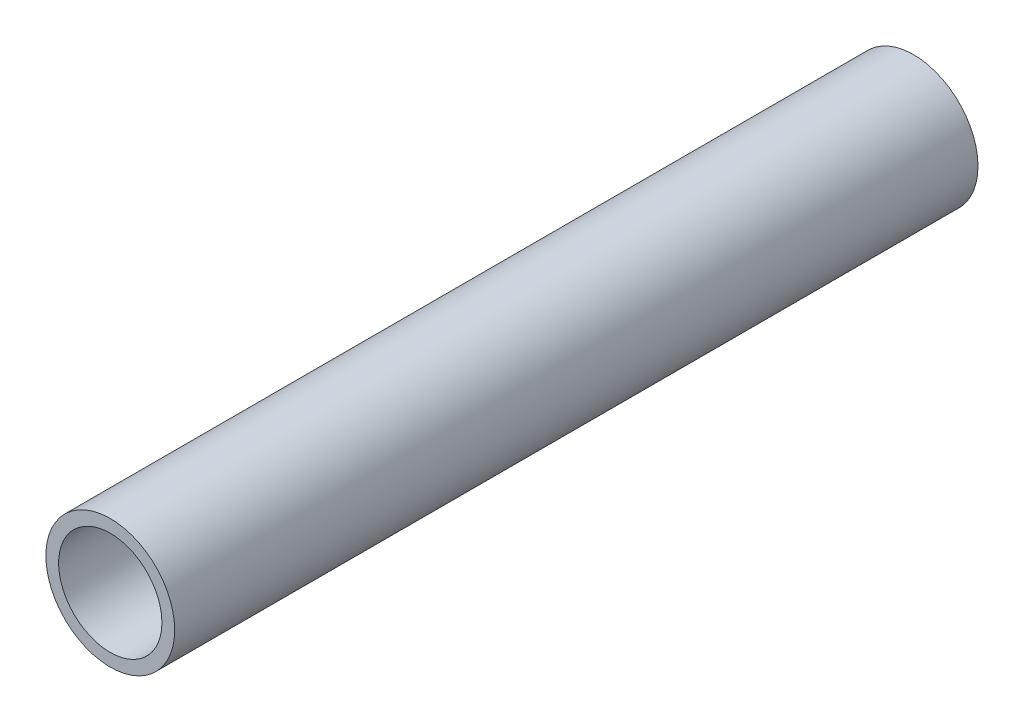
ISO-10303-21;
HEADER;
FILE_DESCRIPTION(('STEP AP214'),'2;1');
FILE_NAME('part.step','',(''),(''),'','','');
FILE_SCHEMA(('AUTOMOTIVE_DESIGN { 1 0 10303 214 1 1 1 1 }'));
ENDSEC;
DATA;
#1=APPLICATION_CONTEXT('core data for automotive mechanical design processes');
#2=APPLICATION_PROTOCOL_DEFINITION('international standard','automotive_design',2000,#1);
#3=PRODUCT_CONTEXT('',#1,'mechanical');
#4=PRODUCT('Part','Part','',(#3));
#5=PRODUCT_RELATED_PRODUCT_CATEGORY('part','',(#4));
#6=PRODUCT_DEFINITION_FORMATION('','',#4);
#7=PRODUCT_DEFINITION_CONTEXT('part definition',#1,'design');
#8=PRODUCT_DEFINITION('design','',#6,#7);
#9=PRODUCT_DEFINITION_SHAPE('','',#8);
#10=(LENGTH_UNIT() NAMED_UNIT(*) SI_UNIT(.MILLI.,.METRE.));
#11=(NAMED_UNIT(*) PLANE_ANGLE_UNIT() SI_UNIT($,.RADIAN.));
#12=(NAMED_UNIT(*) SI_UNIT($,.STERADIAN.) SOLID_ANGLE_UNIT());
#13=UNCERTAINTY_MEASURE_WITH_UNIT(LENGTH_MEASURE(1.E-05),#10,'distance_accuracy_value','');
#14=(GEOMETRIC_REPRESENTATION_CONTEXT(3) GLOBAL_UNCERTAINTY_ASSIGNED_CONTEXT((#13)) GLOBAL_UNIT_ASSIGNED_CONTEXT((#10,
#11,#12)) REPRESENTATION_CONTEXT('',''));
#15=CARTESIAN_POINT('',(0.,0.,0.));
#16=DIRECTION('',(0.,0.,1.));
#17=DIRECTION('',(1.,0.,0.));
#18=AXIS2_PLACEMENT_3D('',#15,#16,#17);
#19=CARTESIAN_POINT('',(0.,0.,63.));
#20=DIRECTION('',(0.,0.,1.));
#21=DIRECTION('',(1.,0.,0.));
#22=AXIS2_PLACEMENT_3D('',#19,#20,#21);
#23=PLANE('',#22);
#24=CARTESIAN_POINT('',(0.,0.,63.));
#25=DIRECTION('',(0.,0.,1.));
#26=DIRECTION('',(1.,0.,0.));
#27=AXIS2_PLACEMENT_3D('',#24,#25,#26);
#28=CIRCLE('',#27,5.05);
#29=CARTESIAN_POINT('',(5.05,0.,63.));
#30=VERTEX_POINT('',#29);
#31=EDGE_CURVE('E11',#30,#30,#28,.T.);
#32=ORIENTED_EDGE('',*,*,#31,.T.);
#33=EDGE_LOOP('',(#32));
#34=FACE_BOUND('',#33,.T.);
#35=CARTESIAN_POINT('',(0.,0.,63.));
#36=DIRECTION('',(0.,0.,1.));
#37=DIRECTION('',(1.,0.,0.));
#38=AXIS2_PLACEMENT_3D('',#35,#36,#37);
#39=CIRCLE('',#38,4.05);
#40=CARTESIAN_POINT('',(4.05,0.,63.));
#41=VERTEX_POINT('',#40);
#42=EDGE_CURVE('E57',#41,#41,#39,.T.);
#43=ORIENTED_EDGE('',*,*,#42,.F.);
#44=EDGE_LOOP('',(#43));
#45=FACE_BOUND('',#44,.T.);
#46=ADVANCED_FACE('F44',(#34,#45),#23,.T.);
#47=CARTESIAN_POINT('',(0.,0.,0.));
#48=DIRECTION('',(0.,0.,1.));
#49=DIRECTION('',(1.,0.,0.));
#50=AXIS2_PLACEMENT_3D('',#47,#48,#49);
#51=PLANE('',#50);
#52=CARTESIAN_POINT('',(0.,0.,0.));
#53=DIRECTION('',(0.,0.,1.));
#54=DIRECTION('',(1.,0.,0.));
#55=AXIS2_PLACEMENT_3D('',#52,#53,#54);
#56=CIRCLE('',#55,5.05);
#57=CARTESIAN_POINT('',(5.05,0.,0.));
#58=VERTEX_POINT('',#57);
#59=EDGE_CURVE('E47',#58,#58,#56,.T.);
#60=ORIENTED_EDGE('',*,*,#59,.F.);
#61=EDGE_LOOP('',(#60));
#62=FACE_BOUND('',#61,.T.);
#63=CARTESIAN_POINT('',(0.,0.,0.));
#64=DIRECTION('',(0.,0.,1.));
#65=DIRECTION('',(1.,0.,0.));
#66=AXIS2_PLACEMENT_3D('',#63,#64,#65);
#67=CIRCLE('',#66,4.05);
#68=CARTESIAN_POINT('',(4.05,0.,0.));
#69=VERTEX_POINT('',#68);
#70=EDGE_CURVE('E59',#69,#69,#67,.T.);
#71=ORIENTED_EDGE('',*,*,#70,.T.);
#72=EDGE_LOOP('',(#71));
#73=FACE_BOUND('',#72,.T.);
#74=ADVANCED_FACE('F68',(#62,#73),#51,.F.);
#75=CARTESIAN_POINT('',(0.,0.,63.));
#76=DIRECTION('',(0.,0.,-1.));
#77=DIRECTION('',(-1.,0.,0.));
#78=AXIS2_PLACEMENT_3D('',#75,#76,#77);
#79=CYLINDRICAL_SURFACE('',#78,5.05);
#80=ORIENTED_EDGE('',*,*,#31,.F.);
#81=EDGE_LOOP('',(#80));
#82=FACE_BOUND('',#81,.T.);
#83=ORIENTED_EDGE('',*,*,#59,.T.);
#84=EDGE_LOOP('',(#83));
#85=FACE_BOUND('',#84,.T.);
#86=ADVANCED_FACE('F50',(#82,#85),#79,.T.);
#87=CARTESIAN_POINT('',(0.,0.,63.));
#88=DIRECTION('',(0.,0.,-1.));
#89=DIRECTION('',(-1.,0.,0.));
#90=AXIS2_PLACEMENT_3D('',#87,#88,#89);
#91=CYLINDRICAL_SURFACE('',#90,4.05);
#92=ORIENTED_EDGE('',*,*,#42,.T.);
#93=EDGE_LOOP('',(#92));
#94=FACE_BOUND('',#93,.T.);
#95=ORIENTED_EDGE('',*,*,#70,.F.);
#96=EDGE_LOOP('',(#95));
#97=FACE_BOUND('',#96,.T.);
#98=ADVANCED_FACE('F63',(#94,#97),#91,.F.);
#99=CLOSED_SHELL('',(#46,#74,#86,#98));
#100=MANIFOLD_SOLID_BREP('B2',#99);
#101=ADVANCED_BREP_SHAPE_REPRESENTATION('',(#18,#100),#14);
#102=SHAPE_DEFINITION_REPRESENTATION(#9,#101);
ENDSEC;
END-ISO-10303-21;
